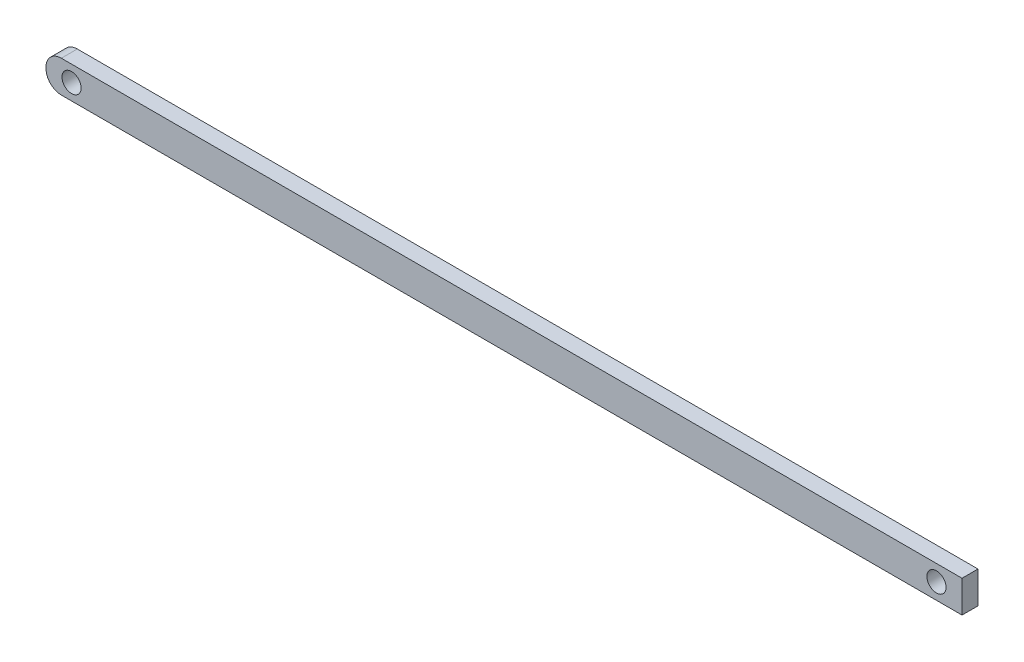
ISO-10303-21;
HEADER;
FILE_DESCRIPTION(('STEP AP214'),'2;1');
FILE_NAME('part.step','',(''),(''),'','','');
FILE_SCHEMA(('AUTOMOTIVE_DESIGN { 1 0 10303 214 1 1 1 1 }'));
ENDSEC;
DATA;
#1=APPLICATION_CONTEXT('core data for automotive mechanical design processes');
#2=APPLICATION_PROTOCOL_DEFINITION('international standard','automotive_design',2000,#1);
#3=PRODUCT_CONTEXT('',#1,'mechanical');
#4=PRODUCT('Part','Part','',(#3));
#5=PRODUCT_RELATED_PRODUCT_CATEGORY('part','',(#4));
#6=PRODUCT_DEFINITION_FORMATION('','',#4);
#7=PRODUCT_DEFINITION_CONTEXT('part definition',#1,'design');
#8=PRODUCT_DEFINITION('design','',#6,#7);
#9=PRODUCT_DEFINITION_SHAPE('','',#8);
#10=(LENGTH_UNIT() NAMED_UNIT(*) SI_UNIT(.MILLI.,.METRE.));
#11=(NAMED_UNIT(*) PLANE_ANGLE_UNIT() SI_UNIT($,.RADIAN.));
#12=(NAMED_UNIT(*) SI_UNIT($,.STERADIAN.) SOLID_ANGLE_UNIT());
#13=UNCERTAINTY_MEASURE_WITH_UNIT(LENGTH_MEASURE(1.E-05),#10,'distance_accuracy_value','');
#14=(GEOMETRIC_REPRESENTATION_CONTEXT(3) GLOBAL_UNCERTAINTY_ASSIGNED_CONTEXT((#13)) GLOBAL_UNIT_ASSIGNED_CONTEXT((#10,
#11,#12)) REPRESENTATION_CONTEXT('',''));
#15=CARTESIAN_POINT('',(0.,0.,0.));
#16=DIRECTION('',(0.,0.,1.));
#17=DIRECTION('',(1.,0.,0.));
#18=AXIS2_PLACEMENT_3D('',#15,#16,#17);
#19=CARTESIAN_POINT('',(0.,0.,25.));
#20=DIRECTION('',(0.,0.,1.));
#21=DIRECTION('',(1.,0.,0.));
#22=AXIS2_PLACEMENT_3D('',#19,#20,#21);
#23=PLANE('',#22);
#24=CARTESIAN_POINT('',(-338.5,0.,25.));
#25=DIRECTION('',(0.,0.,1.));
#26=DIRECTION('',(1.,0.,0.));
#27=AXIS2_PLACEMENT_3D('',#24,#25,#26);
#28=CIRCLE('',#27,7.50000000000001);
#29=CARTESIAN_POINT('',(-331.,0.,25.));
#30=VERTEX_POINT('',#29);
#31=EDGE_CURVE('E141',#30,#30,#28,.T.);
#32=ORIENTED_EDGE('',*,*,#31,.F.);
#33=EDGE_LOOP('',(#32));
#34=FACE_BOUND('',#33,.T.);
#35=DIRECTION('',(0.,-1.,0.));
#36=VECTOR('',#35,1.);
#37=CARTESIAN_POINT('',(-358.5,12.5,25.));
#38=LINE('',#37,#36);
#39=CARTESIAN_POINT('',(-358.5,0.499999999999994,25.));
#40=VERTEX_POINT('',#39);
#41=CARTESIAN_POINT('',(-358.5,-0.500000000000007,25.));
#42=VERTEX_POINT('',#41);
#43=EDGE_CURVE('E124',#40,#42,#38,.T.);
#44=ORIENTED_EDGE('',*,*,#43,.T.);
#45=CARTESIAN_POINT('',(-346.5,-0.500000000000007,25.));
#46=DIRECTION('',(0.,0.,1.));
#47=DIRECTION('',(1.,0.,0.));
#48=AXIS2_PLACEMENT_3D('',#45,#46,#47);
#49=CIRCLE('',#48,12.);
#50=CARTESIAN_POINT('',(-346.5,-12.5,25.));
#51=VERTEX_POINT('',#50);
#52=EDGE_CURVE('E110',#42,#51,#49,.T.);
#53=ORIENTED_EDGE('',*,*,#52,.T.);
#54=DIRECTION('',(1.,0.,0.));
#55=VECTOR('',#54,1.);
#56=CARTESIAN_POINT('',(-358.5,-12.5,25.));
#57=LINE('',#56,#55);
#58=CARTESIAN_POINT('',(358.5,-12.5,25.));
#59=VERTEX_POINT('',#58);
#60=EDGE_CURVE('E122',#51,#59,#57,.T.);
#61=ORIENTED_EDGE('',*,*,#60,.T.);
#62=DIRECTION('',(0.,1.,0.));
#63=VECTOR('',#62,1.);
#64=CARTESIAN_POINT('',(358.5,12.5,25.));
#65=LINE('',#64,#63);
#66=CARTESIAN_POINT('',(358.5,12.5,25.));
#67=VERTEX_POINT('',#66);
#68=EDGE_CURVE('E139',#59,#67,#65,.T.);
#69=ORIENTED_EDGE('',*,*,#68,.T.);
#70=DIRECTION('',(-1.,0.,0.));
#71=VECTOR('',#70,1.);
#72=CARTESIAN_POINT('',(-358.5,12.5,25.));
#73=LINE('',#72,#71);
#74=CARTESIAN_POINT('',(-346.5,12.5,25.));
#75=VERTEX_POINT('',#74);
#76=EDGE_CURVE('E137',#67,#75,#73,.T.);
#77=ORIENTED_EDGE('',*,*,#76,.T.);
#78=CARTESIAN_POINT('',(-346.5,0.499999999999994,25.));
#79=DIRECTION('',(0.,0.,1.));
#80=DIRECTION('',(1.,0.,0.));
#81=AXIS2_PLACEMENT_3D('',#78,#79,#80);
#82=CIRCLE('',#81,12.);
#83=EDGE_CURVE('E111',#75,#40,#82,.T.);
#84=ORIENTED_EDGE('',*,*,#83,.T.);
#85=EDGE_LOOP('',(#44,#53,#61,#69,#77,#84));
#86=FACE_BOUND('',#85,.T.);
#87=CARTESIAN_POINT('',(338.5,0.,25.));
#88=DIRECTION('',(0.,0.,1.));
#89=DIRECTION('',(1.,0.,0.));
#90=AXIS2_PLACEMENT_3D('',#87,#88,#89);
#91=CIRCLE('',#90,7.50000000000001);
#92=CARTESIAN_POINT('',(346.,0.,25.));
#93=VERTEX_POINT('',#92);
#94=EDGE_CURVE('E144',#93,#93,#91,.T.);
#95=ORIENTED_EDGE('',*,*,#94,.F.);
#96=EDGE_LOOP('',(#95));
#97=FACE_BOUND('',#96,.T.);
#98=ADVANCED_FACE('F38',(#34,#86,#97),#23,.T.);
#99=CARTESIAN_POINT('',(358.5,12.5,25.));
#100=DIRECTION('',(-1.,0.,0.));
#101=DIRECTION('',(0.,0.,1.));
#102=AXIS2_PLACEMENT_3D('',#99,#100,#101);
#103=PLANE('',#102);
#104=DIRECTION('',(0.,0.,-1.));
#105=VECTOR('',#104,1.);
#106=CARTESIAN_POINT('',(358.5,-12.5,25.));
#107=LINE('',#106,#105);
#108=CARTESIAN_POINT('',(358.5,-12.5,12.5));
#109=VERTEX_POINT('',#108);
#110=EDGE_CURVE('E128',#59,#109,#107,.T.);
#111=ORIENTED_EDGE('',*,*,#110,.T.);
#112=DIRECTION('',(0.,1.,0.));
#113=VECTOR('',#112,1.);
#114=CARTESIAN_POINT('',(358.5,12.5,12.5));
#115=LINE('',#114,#113);
#116=CARTESIAN_POINT('',(358.5,12.5,12.5));
#117=VERTEX_POINT('',#116);
#118=EDGE_CURVE('E147',#109,#117,#115,.T.);
#119=ORIENTED_EDGE('',*,*,#118,.T.);
#120=DIRECTION('',(0.,0.,-1.));
#121=VECTOR('',#120,1.);
#122=CARTESIAN_POINT('',(358.5,12.5,25.));
#123=LINE('',#122,#121);
#124=EDGE_CURVE('E131',#67,#117,#123,.T.);
#125=ORIENTED_EDGE('',*,*,#124,.F.);
#126=ORIENTED_EDGE('',*,*,#68,.F.);
#127=EDGE_LOOP('',(#111,#119,#125,#126));
#128=FACE_BOUND('',#127,.T.);
#129=ADVANCED_FACE('F157',(#128),#103,.F.);
#130=CARTESIAN_POINT('',(-358.5,12.5,25.));
#131=DIRECTION('',(0.,-1.,0.));
#132=DIRECTION('',(0.,0.,-1.));
#133=AXIS2_PLACEMENT_3D('',#130,#131,#132);
#134=PLANE('',#133);
#135=ORIENTED_EDGE('',*,*,#124,.T.);
#136=DIRECTION('',(1.,0.,0.));
#137=VECTOR('',#136,1.);
#138=CARTESIAN_POINT('',(-358.5,12.5,12.5));
#139=LINE('',#138,#137);
#140=CARTESIAN_POINT('',(-346.5,12.5,12.5));
#141=VERTEX_POINT('',#140);
#142=EDGE_CURVE('E106',#141,#117,#139,.T.);
#143=ORIENTED_EDGE('',*,*,#142,.F.);
#144=DIRECTION('',(0.,0.,-1.));
#145=VECTOR('',#144,1.);
#146=CARTESIAN_POINT('',(-346.5,12.5,25.));
#147=LINE('',#146,#145);
#148=EDGE_CURVE('E46',#141,#75,#147,.F.);
#149=ORIENTED_EDGE('',*,*,#148,.T.);
#150=ORIENTED_EDGE('',*,*,#76,.F.);
#151=EDGE_LOOP('',(#135,#143,#149,#150));
#152=FACE_BOUND('',#151,.T.);
#153=ADVANCED_FACE('F161',(#152),#134,.F.);
#154=CARTESIAN_POINT('',(-358.5,12.5,25.));
#155=DIRECTION('',(1.,0.,0.));
#156=DIRECTION('',(0.,0.,-1.));
#157=AXIS2_PLACEMENT_3D('',#154,#155,#156);
#158=PLANE('',#157);
#159=DIRECTION('',(0.,0.,-1.));
#160=VECTOR('',#159,1.);
#161=CARTESIAN_POINT('',(-358.5,0.499999999999994,25.));
#162=LINE('',#161,#160);
#163=CARTESIAN_POINT('',(-358.5,0.499999999999994,12.5));
#164=VERTEX_POINT('',#163);
#165=EDGE_CURVE('E105',#40,#164,#162,.T.);
#166=ORIENTED_EDGE('',*,*,#165,.T.);
#167=DIRECTION('',(0.,-1.,0.));
#168=VECTOR('',#167,1.);
#169=CARTESIAN_POINT('',(-358.5,12.5,12.5));
#170=LINE('',#169,#168);
#171=CARTESIAN_POINT('',(-358.5,-0.500000000000007,12.5));
#172=VERTEX_POINT('',#171);
#173=EDGE_CURVE('E52',#164,#172,#170,.T.);
#174=ORIENTED_EDGE('',*,*,#173,.T.);
#175=DIRECTION('',(0.,0.,-1.));
#176=VECTOR('',#175,1.);
#177=CARTESIAN_POINT('',(-358.5,-0.500000000000007,25.));
#178=LINE('',#177,#176);
#179=EDGE_CURVE('E102',#172,#42,#178,.F.);
#180=ORIENTED_EDGE('',*,*,#179,.T.);
#181=ORIENTED_EDGE('',*,*,#43,.F.);
#182=EDGE_LOOP('',(#166,#174,#180,#181));
#183=FACE_BOUND('',#182,.T.);
#184=ADVANCED_FACE('F100',(#183),#158,.F.);
#185=CARTESIAN_POINT('',(-358.5,-12.5,25.));
#186=DIRECTION('',(0.,1.,0.));
#187=DIRECTION('',(0.,0.,1.));
#188=AXIS2_PLACEMENT_3D('',#185,#186,#187);
#189=PLANE('',#188);
#190=DIRECTION('',(0.,0.,-1.));
#191=VECTOR('',#190,1.);
#192=CARTESIAN_POINT('',(-346.5,-12.5,25.));
#193=LINE('',#192,#191);
#194=CARTESIAN_POINT('',(-346.5,-12.5,12.5));
#195=VERTEX_POINT('',#194);
#196=EDGE_CURVE('E114',#51,#195,#193,.T.);
#197=ORIENTED_EDGE('',*,*,#196,.T.);
#198=DIRECTION('',(1.,0.,0.));
#199=VECTOR('',#198,1.);
#200=CARTESIAN_POINT('',(-358.5,-12.5,12.5));
#201=LINE('',#200,#199);
#202=EDGE_CURVE('E91',#195,#109,#201,.T.);
#203=ORIENTED_EDGE('',*,*,#202,.T.);
#204=ORIENTED_EDGE('',*,*,#110,.F.);
#205=ORIENTED_EDGE('',*,*,#60,.F.);
#206=EDGE_LOOP('',(#197,#203,#204,#205));
#207=FACE_BOUND('',#206,.T.);
#208=ADVANCED_FACE('F126',(#207),#189,.F.);
#209=CARTESIAN_POINT('',(-338.5,0.,25.));
#210=DIRECTION('',(0.,0.,-1.));
#211=DIRECTION('',(-1.,0.,0.));
#212=AXIS2_PLACEMENT_3D('',#209,#210,#211);
#213=CYLINDRICAL_SURFACE('',#212,7.50000000000001);
#214=CARTESIAN_POINT('',(-338.5,0.,12.5));
#215=DIRECTION('',(0.,0.,1.));
#216=DIRECTION('',(1.,0.,0.));
#217=AXIS2_PLACEMENT_3D('',#214,#215,#216);
#218=CIRCLE('',#217,7.50000000000001);
#219=CARTESIAN_POINT('',(-331.,0.,12.5));
#220=VERTEX_POINT('',#219);
#221=EDGE_CURVE('E150',#220,#220,#218,.T.);
#222=ORIENTED_EDGE('',*,*,#221,.F.);
#223=EDGE_LOOP('',(#222));
#224=FACE_BOUND('',#223,.T.);
#225=ORIENTED_EDGE('',*,*,#31,.T.);
#226=EDGE_LOOP('',(#225));
#227=FACE_BOUND('',#226,.T.);
#228=ADVANCED_FACE('F178',(#224,#227),#213,.F.);
#229=CARTESIAN_POINT('',(338.5,0.,25.));
#230=DIRECTION('',(0.,0.,-1.));
#231=DIRECTION('',(-1.,0.,0.));
#232=AXIS2_PLACEMENT_3D('',#229,#230,#231);
#233=CYLINDRICAL_SURFACE('',#232,7.50000000000001);
#234=CARTESIAN_POINT('',(338.5,0.,12.5));
#235=DIRECTION('',(0.,0.,1.));
#236=DIRECTION('',(1.,0.,0.));
#237=AXIS2_PLACEMENT_3D('',#234,#235,#236);
#238=CIRCLE('',#237,7.50000000000001);
#239=CARTESIAN_POINT('',(346.,0.,12.5));
#240=VERTEX_POINT('',#239);
#241=EDGE_CURVE('E96',#240,#240,#238,.T.);
#242=ORIENTED_EDGE('',*,*,#241,.F.);
#243=EDGE_LOOP('',(#242));
#244=FACE_BOUND('',#243,.T.);
#245=ORIENTED_EDGE('',*,*,#94,.T.);
#246=EDGE_LOOP('',(#245));
#247=FACE_BOUND('',#246,.T.);
#248=ADVANCED_FACE('F184',(#244,#247),#233,.F.);
#249=CARTESIAN_POINT('',(-346.5,-0.500000000000007,25.));
#250=DIRECTION('',(0.,0.,-1.));
#251=DIRECTION('',(-1.,0.,0.));
#252=AXIS2_PLACEMENT_3D('',#249,#250,#251);
#253=CYLINDRICAL_SURFACE('',#252,12.);
#254=CARTESIAN_POINT('',(-346.5,-0.500000000000007,12.5));
#255=DIRECTION('',(0.,0.,1.));
#256=DIRECTION('',(1.,0.,0.));
#257=AXIS2_PLACEMENT_3D('',#254,#255,#256);
#258=CIRCLE('',#257,12.);
#259=EDGE_CURVE('E88',#195,#172,#258,.F.);
#260=ORIENTED_EDGE('',*,*,#259,.F.);
#261=ORIENTED_EDGE('',*,*,#196,.F.);
#262=ORIENTED_EDGE('',*,*,#52,.F.);
#263=ORIENTED_EDGE('',*,*,#179,.F.);
#264=EDGE_LOOP('',(#260,#261,#262,#263));
#265=FACE_BOUND('',#264,.T.);
#266=ADVANCED_FACE('F109',(#265),#253,.T.);
#267=CARTESIAN_POINT('',(-346.5,0.499999999999994,25.));
#268=DIRECTION('',(0.,0.,-1.));
#269=DIRECTION('',(-1.,0.,0.));
#270=AXIS2_PLACEMENT_3D('',#267,#268,#269);
#271=CYLINDRICAL_SURFACE('',#270,12.);
#272=CARTESIAN_POINT('',(-346.5,0.499999999999994,12.5));
#273=DIRECTION('',(0.,0.,1.));
#274=DIRECTION('',(1.,0.,0.));
#275=AXIS2_PLACEMENT_3D('',#272,#273,#274);
#276=CIRCLE('',#275,12.);
#277=EDGE_CURVE('E11',#164,#141,#276,.F.);
#278=ORIENTED_EDGE('',*,*,#277,.F.);
#279=ORIENTED_EDGE('',*,*,#165,.F.);
#280=ORIENTED_EDGE('',*,*,#83,.F.);
#281=ORIENTED_EDGE('',*,*,#148,.F.);
#282=EDGE_LOOP('',(#278,#279,#280,#281));
#283=FACE_BOUND('',#282,.T.);
#284=ADVANCED_FACE('F40',(#283),#271,.T.);
#285=CARTESIAN_POINT('',(-358.5,12.5,12.5));
#286=DIRECTION('',(0.,0.,1.));
#287=DIRECTION('',(1.,0.,0.));
#288=AXIS2_PLACEMENT_3D('',#285,#286,#287);
#289=PLANE('',#288);
#290=ORIENTED_EDGE('',*,*,#221,.T.);
#291=EDGE_LOOP('',(#290));
#292=FACE_BOUND('',#291,.T.);
#293=ORIENTED_EDGE('',*,*,#241,.T.);
#294=EDGE_LOOP('',(#293));
#295=FACE_BOUND('',#294,.T.);
#296=ORIENTED_EDGE('',*,*,#202,.F.);
#297=ORIENTED_EDGE('',*,*,#259,.T.);
#298=ORIENTED_EDGE('',*,*,#173,.F.);
#299=ORIENTED_EDGE('',*,*,#277,.T.);
#300=ORIENTED_EDGE('',*,*,#142,.T.);
#301=ORIENTED_EDGE('',*,*,#118,.F.);
#302=EDGE_LOOP('',(#296,#297,#298,#299,#300,#301));
#303=FACE_BOUND('',#302,.T.);
#304=ADVANCED_FACE('F89',(#292,#295,#303),#289,.F.);
#305=CLOSED_SHELL('',(#98,#129,#153,#184,#208,#228,#248,#266,#284,#304));
#306=MANIFOLD_SOLID_BREP('B2',#305);
#307=ADVANCED_BREP_SHAPE_REPRESENTATION('',(#18,#306),#14);
#308=SHAPE_DEFINITION_REPRESENTATION(#9,#307);
ENDSEC;
END-ISO-10303-21;
